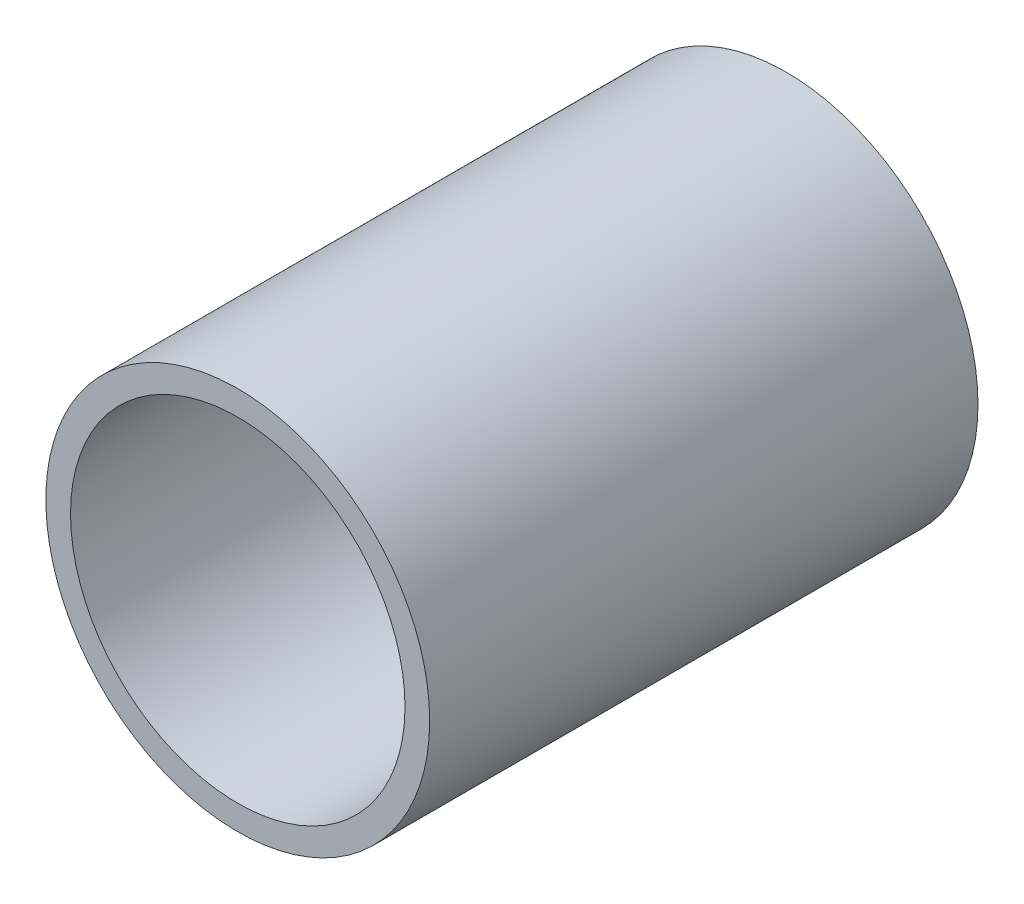
ISO-10303-21;
HEADER;
FILE_DESCRIPTION(('STEP AP214'),'2;1');
FILE_NAME('part.step','',(''),(''),'','','');
FILE_SCHEMA(('AUTOMOTIVE_DESIGN { 1 0 10303 214 1 1 1 1 }'));
ENDSEC;
DATA;
#1=APPLICATION_CONTEXT('core data for automotive mechanical design processes');
#2=APPLICATION_PROTOCOL_DEFINITION('international standard','automotive_design',2000,#1);
#3=PRODUCT_CONTEXT('',#1,'mechanical');
#4=PRODUCT('Part','Part','',(#3));
#5=PRODUCT_RELATED_PRODUCT_CATEGORY('part','',(#4));
#6=PRODUCT_DEFINITION_FORMATION('','',#4);
#7=PRODUCT_DEFINITION_CONTEXT('part definition',#1,'design');
#8=PRODUCT_DEFINITION('design','',#6,#7);
#9=PRODUCT_DEFINITION_SHAPE('','',#8);
#10=(LENGTH_UNIT() NAMED_UNIT(*) SI_UNIT(.MILLI.,.METRE.));
#11=(NAMED_UNIT(*) PLANE_ANGLE_UNIT() SI_UNIT($,.RADIAN.));
#12=(NAMED_UNIT(*) SI_UNIT($,.STERADIAN.) SOLID_ANGLE_UNIT());
#13=UNCERTAINTY_MEASURE_WITH_UNIT(LENGTH_MEASURE(1.E-05),#10,'distance_accuracy_value','');
#14=(GEOMETRIC_REPRESENTATION_CONTEXT(3) GLOBAL_UNCERTAINTY_ASSIGNED_CONTEXT((#13)) GLOBAL_UNIT_ASSIGNED_CONTEXT((#10,
#11,#12)) REPRESENTATION_CONTEXT('',''));
#15=CARTESIAN_POINT('',(0.,0.,0.));
#16=DIRECTION('',(0.,0.,1.));
#17=DIRECTION('',(1.,0.,0.));
#18=AXIS2_PLACEMENT_3D('',#15,#16,#17);
#19=CARTESIAN_POINT('',(0.,0.,5.));
#20=DIRECTION('',(0.,0.,1.));
#21=DIRECTION('',(1.,0.,0.));
#22=AXIS2_PLACEMENT_3D('',#19,#20,#21);
#23=PLANE('',#22);
#24=CARTESIAN_POINT('',(0.,0.,5.));
#25=DIRECTION('',(0.,0.,1.));
#26=DIRECTION('',(1.,0.,0.));
#27=AXIS2_PLACEMENT_3D('',#24,#25,#26);
#28=CIRCLE('',#27,3.5);
#29=CARTESIAN_POINT('',(3.5,0.,5.));
#30=VERTEX_POINT('',#29);
#31=EDGE_CURVE('E10',#30,#30,#28,.T.);
#32=ORIENTED_EDGE('',*,*,#31,.T.);
#33=EDGE_LOOP('',(#32));
#34=FACE_BOUND('',#33,.T.);
#35=CARTESIAN_POINT('',(0.,0.,5.));
#36=DIRECTION('',(0.,0.,1.));
#37=DIRECTION('',(1.,0.,0.));
#38=AXIS2_PLACEMENT_3D('',#35,#36,#37);
#39=CIRCLE('',#38,3.05);
#40=CARTESIAN_POINT('',(3.05,0.,5.));
#41=VERTEX_POINT('',#40);
#42=EDGE_CURVE('E51',#41,#41,#39,.T.);
#43=ORIENTED_EDGE('',*,*,#42,.F.);
#44=EDGE_LOOP('',(#43));
#45=FACE_BOUND('',#44,.T.);
#46=ADVANCED_FACE('F43',(#34,#45),#23,.T.);
#47=CARTESIAN_POINT('',(0.,0.,5.));
#48=DIRECTION('',(0.,0.,-1.));
#49=DIRECTION('',(-1.,0.,0.));
#50=AXIS2_PLACEMENT_3D('',#47,#48,#49);
#51=CYLINDRICAL_SURFACE('',#50,3.5);
#52=ORIENTED_EDGE('',*,*,#31,.F.);
#53=EDGE_LOOP('',(#52));
#54=FACE_BOUND('',#53,.T.);
#55=CARTESIAN_POINT('',(0.,0.,-5.));
#56=DIRECTION('',(0.,0.,1.));
#57=DIRECTION('',(1.,0.,0.));
#58=AXIS2_PLACEMENT_3D('',#55,#56,#57);
#59=CIRCLE('',#58,3.5);
#60=CARTESIAN_POINT('',(3.5,0.,-5.));
#61=VERTEX_POINT('',#60);
#62=EDGE_CURVE('E56',#61,#61,#59,.T.);
#63=ORIENTED_EDGE('',*,*,#62,.T.);
#64=EDGE_LOOP('',(#63));
#65=FACE_BOUND('',#64,.T.);
#66=ADVANCED_FACE('F45',(#54,#65),#51,.T.);
#67=CARTESIAN_POINT('',(0.,0.,5.));
#68=DIRECTION('',(0.,0.,-1.));
#69=DIRECTION('',(-1.,0.,0.));
#70=AXIS2_PLACEMENT_3D('',#67,#68,#69);
#71=CYLINDRICAL_SURFACE('',#70,3.05);
#72=ORIENTED_EDGE('',*,*,#42,.T.);
#73=EDGE_LOOP('',(#72));
#74=FACE_BOUND('',#73,.T.);
#75=CARTESIAN_POINT('',(0.,0.,-5.));
#76=DIRECTION('',(0.,0.,1.));
#77=DIRECTION('',(1.,0.,0.));
#78=AXIS2_PLACEMENT_3D('',#75,#76,#77);
#79=CIRCLE('',#78,3.05);
#80=CARTESIAN_POINT('',(3.05,0.,-5.));
#81=VERTEX_POINT('',#80);
#82=EDGE_CURVE('E61',#81,#81,#79,.T.);
#83=ORIENTED_EDGE('',*,*,#82,.F.);
#84=EDGE_LOOP('',(#83));
#85=FACE_BOUND('',#84,.T.);
#86=ADVANCED_FACE('F71',(#74,#85),#71,.F.);
#87=CARTESIAN_POINT('',(0.,0.,-5.));
#88=DIRECTION('',(0.,0.,1.));
#89=DIRECTION('',(1.,0.,0.));
#90=AXIS2_PLACEMENT_3D('',#87,#88,#89);
#91=PLANE('',#90);
#92=ORIENTED_EDGE('',*,*,#82,.T.);
#93=EDGE_LOOP('',(#92));
#94=FACE_BOUND('',#93,.T.);
#95=ORIENTED_EDGE('',*,*,#62,.F.);
#96=EDGE_LOOP('',(#95));
#97=FACE_BOUND('',#96,.T.);
#98=ADVANCED_FACE('F68',(#94,#97),#91,.F.);
#99=CLOSED_SHELL('',(#46,#66,#86,#98));
#100=MANIFOLD_SOLID_BREP('B2',#99);
#101=ADVANCED_BREP_SHAPE_REPRESENTATION('',(#18,#100),#14);
#102=SHAPE_DEFINITION_REPRESENTATION(#9,#101);
ENDSEC;
END-ISO-10303-21;
